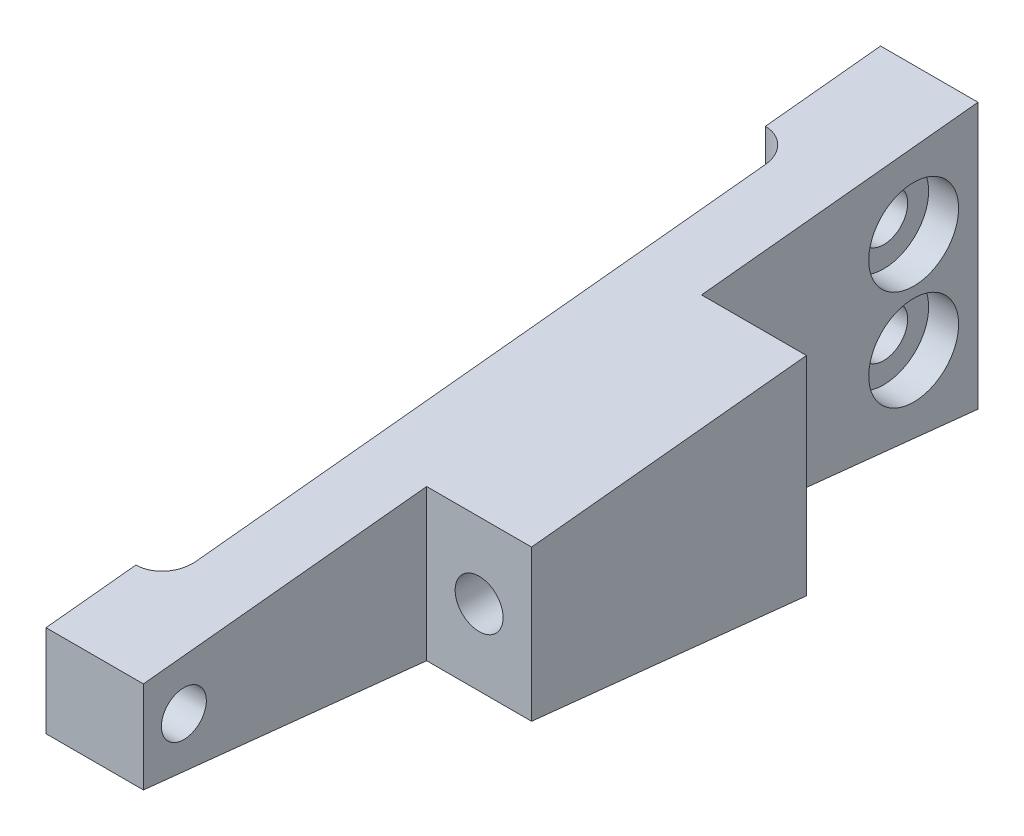
ISO-10303-21;
HEADER;
FILE_DESCRIPTION(('STEP AP214'),'2;1');
FILE_NAME('part.step','',(''),(''),'','','');
FILE_SCHEMA(('AUTOMOTIVE_DESIGN { 1 0 10303 214 1 1 1 1 }'));
ENDSEC;
DATA;
#1=APPLICATION_CONTEXT('core data for automotive mechanical design processes');
#2=APPLICATION_PROTOCOL_DEFINITION('international standard','automotive_design',2000,#1);
#3=PRODUCT_CONTEXT('',#1,'mechanical');
#4=PRODUCT('Part','Part','',(#3));
#5=PRODUCT_RELATED_PRODUCT_CATEGORY('part','',(#4));
#6=PRODUCT_DEFINITION_FORMATION('','',#4);
#7=PRODUCT_DEFINITION_CONTEXT('part definition',#1,'design');
#8=PRODUCT_DEFINITION('design','',#6,#7);
#9=PRODUCT_DEFINITION_SHAPE('','',#8);
#10=(LENGTH_UNIT() NAMED_UNIT(*) SI_UNIT(.MILLI.,.METRE.));
#11=(NAMED_UNIT(*) PLANE_ANGLE_UNIT() SI_UNIT($,.RADIAN.));
#12=(NAMED_UNIT(*) SI_UNIT($,.STERADIAN.) SOLID_ANGLE_UNIT());
#13=UNCERTAINTY_MEASURE_WITH_UNIT(LENGTH_MEASURE(1.E-05),#10,'distance_accuracy_value','');
#14=(GEOMETRIC_REPRESENTATION_CONTEXT(3) GLOBAL_UNCERTAINTY_ASSIGNED_CONTEXT((#13)) GLOBAL_UNIT_ASSIGNED_CONTEXT((#10,
#11,#12)) REPRESENTATION_CONTEXT('',''));
#15=CARTESIAN_POINT('',(0.,0.,0.));
#16=DIRECTION('',(0.,0.,1.));
#17=DIRECTION('',(1.,0.,0.));
#18=AXIS2_PLACEMENT_3D('',#15,#16,#17);
#19=CARTESIAN_POINT('',(-156.520659717532,115.962807964112,228.95028340893));
#20=DIRECTION('',(1.,0.,0.));
#21=DIRECTION('',(0.,-1.,0.));
#22=AXIS2_PLACEMENT_3D('',#19,#20,#21);
#23=PLANE('',#22);
#24=CARTESIAN_POINT('',(-156.520659717532,115.966690244608,229.250284198691));
#25=DIRECTION('',(-1.,0.,0.));
#26=DIRECTION('',(0.,1.,0.));
#27=AXIS2_PLACEMENT_3D('',#24,#25,#26);
#28=CIRCLE('',#27,1.50000002235174);
#29=CARTESIAN_POINT('',(-156.520659717532,114.466690222257,229.250284198691));
#30=VERTEX_POINT('',#29);
#31=EDGE_CURVE('E27',#30,#30,#28,.T.);
#32=ORIENTED_EDGE('',*,*,#31,.F.);
#33=EDGE_LOOP('',(#32));
#34=FACE_BOUND('',#33,.T.);
#35=DIRECTION('',(0.,-0.104293034034684,-0.994546611804515));
#36=VECTOR('',#35,1.);
#37=CARTESIAN_POINT('',(-156.520659717532,112.90155529547,231.95028340893));
#38=LINE('',#37,#36);
#39=CARTESIAN_POINT('',(-156.520659717532,112.90155529547,231.95028340893));
#40=VERTEX_POINT('',#39);
#41=CARTESIAN_POINT('',(-156.520659717532,112.272365877115,225.95028340893));
#42=VERTEX_POINT('',#41);
#43=EDGE_CURVE('E241',#40,#42,#38,.T.);
#44=ORIENTED_EDGE('',*,*,#43,.F.);
#45=DIRECTION('',(0.,1.,0.));
#46=VECTOR('',#45,1.);
#47=CARTESIAN_POINT('',(-156.520659717532,112.90155529547,231.95028340893));
#48=LINE('',#47,#46);
#49=CARTESIAN_POINT('',(-156.520659717532,119.031825193747,231.95028340893));
#50=VERTEX_POINT('',#49);
#51=EDGE_CURVE('E11',#40,#50,#48,.T.);
#52=ORIENTED_EDGE('',*,*,#51,.T.);
#53=DIRECTION('',(0.,-0.103019741551588,0.994679311562598));
#54=VECTOR('',#53,1.);
#55=CARTESIAN_POINT('',(-156.520659717532,124.799997210503,176.257255216579));
#56=LINE('',#55,#54);
#57=CARTESIAN_POINT('',(-156.520659717532,119.65325005111,225.95028340893));
#58=VERTEX_POINT('',#57);
#59=EDGE_CURVE('E297',#58,#50,#56,.T.);
#60=ORIENTED_EDGE('',*,*,#59,.F.);
#61=DIRECTION('',(0.,1.,0.));
#62=VECTOR('',#61,1.);
#63=CARTESIAN_POINT('',(-156.520659717532,112.272365877115,225.95028340893));
#64=LINE('',#63,#62);
#65=EDGE_CURVE('E183',#42,#58,#64,.T.);
#66=ORIENTED_EDGE('',*,*,#65,.F.);
#67=EDGE_LOOP('',(#44,#52,#60,#66));
#68=FACE_BOUND('',#67,.T.);
#69=ADVANCED_FACE('F16',(#34,#68),#23,.F.);
#70=CARTESIAN_POINT('',(-156.520659717532,119.031825193747,231.95028340893));
#71=DIRECTION('',(0.,0.,1.));
#72=DIRECTION('',(0.,-1.,0.));
#73=AXIS2_PLACEMENT_3D('',#70,#71,#72);
#74=PLANE('',#73);
#75=DIRECTION('',(1.,0.,0.));
#76=VECTOR('',#75,1.);
#77=CARTESIAN_POINT('',(-156.520659717532,119.031825193747,231.95028340893));
#78=LINE('',#77,#76);
#79=CARTESIAN_POINT('',(-150.020659717532,119.031825193747,231.95028340893));
#80=VERTEX_POINT('',#79);
#81=EDGE_CURVE('E283',#50,#80,#78,.T.);
#82=ORIENTED_EDGE('',*,*,#81,.F.);
#83=ORIENTED_EDGE('',*,*,#51,.F.);
#84=DIRECTION('',(1.,0.,0.));
#85=VECTOR('',#84,1.);
#86=CARTESIAN_POINT('',(-153.020659717532,112.90155529547,231.95028340893));
#87=LINE('',#86,#85);
#88=CARTESIAN_POINT('',(-150.020659717532,112.90155529547,231.95028340893));
#89=VERTEX_POINT('',#88);
#90=EDGE_CURVE('E239',#40,#89,#87,.T.);
#91=ORIENTED_EDGE('',*,*,#90,.T.);
#92=DIRECTION('',(0.,-1.,0.));
#93=VECTOR('',#92,1.);
#94=CARTESIAN_POINT('',(-150.020659717532,117.481239722751,231.95028340893));
#95=LINE('',#94,#93);
#96=EDGE_CURVE('E259',#80,#89,#95,.T.);
#97=ORIENTED_EDGE('',*,*,#96,.F.);
#98=EDGE_LOOP('',(#82,#83,#91,#97));
#99=FACE_BOUND('',#98,.T.);
#100=ADVANCED_FACE('F412',(#99),#74,.T.);
#101=CARTESIAN_POINT('',(-156.520659717532,115.966690244608,229.250284198691));
#102=DIRECTION('',(1.,0.,0.));
#103=DIRECTION('',(0.,1.,0.));
#104=AXIS2_PLACEMENT_3D('',#101,#102,#103);
#105=CYLINDRICAL_SURFACE('',#104,1.50000002235174);
#106=CARTESIAN_POINT('',(-150.020659717532,115.966690244608,229.250284198691));
#107=DIRECTION('',(-1.,0.,0.));
#108=DIRECTION('',(0.,1.,0.));
#109=AXIS2_PLACEMENT_3D('',#106,#107,#108);
#110=CIRCLE('',#109,1.50000002235174);
#111=CARTESIAN_POINT('',(-150.020659717532,114.466690222257,229.250284198691));
#112=VERTEX_POINT('',#111);
#113=EDGE_CURVE('E301',#112,#112,#110,.T.);
#114=ORIENTED_EDGE('',*,*,#113,.F.);
#115=DIRECTION('',(-1.,0.,0.));
#116=VECTOR('',#115,1.);
#117=CARTESIAN_POINT('',(-156.520659717532,114.466690222257,229.250284198691));
#118=LINE('',#117,#116);
#119=EDGE_CURVE('E275',#112,#30,#118,.T.);
#120=ORIENTED_EDGE('',*,*,#119,.T.);
#121=ORIENTED_EDGE('',*,*,#31,.T.);
#122=ORIENTED_EDGE('',*,*,#119,.F.);
#123=EDGE_LOOP('',(#114,#120,#121,#122));
#124=FACE_BOUND('',#123,.T.);
#125=ADVANCED_FACE('F454',(#124),#105,.F.);
#126=CARTESIAN_POINT('',(-156.520659717532,115.930654251756,180.102366744316));
#127=DIRECTION('',(1.,0.,0.));
#128=DIRECTION('',(0.,0.,-1.));
#129=AXIS2_PLACEMENT_3D('',#126,#127,#128);
#130=PLANE('',#129);
#131=CARTESIAN_POINT('',(-156.520659717532,119.316690244608,180.550283500966));
#132=DIRECTION('',(1.,0.,0.));
#133=DIRECTION('',(0.,1.,0.));
#134=AXIS2_PLACEMENT_3D('',#131,#132,#133);
#135=CIRCLE('',#134,1.6);
#136=CARTESIAN_POINT('',(-156.520659717532,117.716690244608,180.550283500966));
#137=VERTEX_POINT('',#136);
#138=EDGE_CURVE('E148',#137,#137,#135,.T.);
#139=ORIENTED_EDGE('',*,*,#138,.T.);
#140=EDGE_LOOP('',(#139));
#141=FACE_BOUND('',#140,.T.);
#142=CARTESIAN_POINT('',(-156.520659717532,112.616690244608,180.550283500966));
#143=DIRECTION('',(1.,0.,0.));
#144=DIRECTION('',(0.,1.,0.));
#145=AXIS2_PLACEMENT_3D('',#142,#143,#144);
#146=CIRCLE('',#145,1.6);
#147=CARTESIAN_POINT('',(-156.520659717532,111.016690244608,180.550283500966));
#148=VERTEX_POINT('',#147);
#149=EDGE_CURVE('E139',#148,#148,#146,.T.);
#150=ORIENTED_EDGE('',*,*,#149,.T.);
#151=EDGE_LOOP('',(#150));
#152=FACE_BOUND('',#151,.T.);
#153=DIRECTION('',(0.,1.,0.));
#154=VECTOR('',#153,1.);
#155=CARTESIAN_POINT('',(-156.520659717532,107.061311293008,176.257255216579));
#156=LINE('',#155,#154);
#157=CARTESIAN_POINT('',(-156.520659717532,107.061311293008,176.257255216579));
#158=VERTEX_POINT('',#157);
#159=CARTESIAN_POINT('',(-156.520659717532,124.799997210503,176.257255216579));
#160=VERTEX_POINT('',#159);
#161=EDGE_CURVE('E202',#158,#160,#156,.T.);
#162=ORIENTED_EDGE('',*,*,#161,.F.);
#163=DIRECTION('',(0.,-0.104293034034684,-0.994546611804515));
#164=VECTOR('',#163,1.);
#165=CARTESIAN_POINT('',(-156.520659717532,112.90155529547,231.95028340893));
#166=LINE('',#165,#164);
#167=CARTESIAN_POINT('',(-156.520659717532,107.867745788224,183.947478272054));
#168=VERTEX_POINT('',#167);
#169=EDGE_CURVE('E198',#168,#158,#166,.T.);
#170=ORIENTED_EDGE('',*,*,#169,.F.);
#171=DIRECTION('',(0.,1.,0.));
#172=VECTOR('',#171,1.);
#173=CARTESIAN_POINT('',(-156.520659717532,107.867745788224,183.947478272054));
#174=LINE('',#173,#172);
#175=CARTESIAN_POINT('',(-156.520659717532,124.003514582947,183.947478272054));
#176=VERTEX_POINT('',#175);
#177=EDGE_CURVE('E191',#168,#176,#174,.T.);
#178=ORIENTED_EDGE('',*,*,#177,.T.);
#179=DIRECTION('',(0.,-0.103019741551588,0.994679311562598));
#180=VECTOR('',#179,1.);
#181=CARTESIAN_POINT('',(-156.520659717532,124.799997210503,176.257255216579));
#182=LINE('',#181,#180);
#183=EDGE_CURVE('E195',#160,#176,#182,.T.);
#184=ORIENTED_EDGE('',*,*,#183,.F.);
#185=EDGE_LOOP('',(#162,#170,#178,#184));
#186=FACE_BOUND('',#185,.T.);
#187=ADVANCED_FACE('F193',(#141,#152,#186),#130,.F.);
#188=CARTESIAN_POINT('',(-156.520659717532,114.10399803135,223.95028340893));
#189=DIRECTION('',(0.,-1.,0.));
#190=DIRECTION('',(0.707106781186554,0.,0.707106781186541));
#191=AXIS2_PLACEMENT_3D('',#188,#189,#190);
#192=CYLINDRICAL_SURFACE('',#191,2.);
#193=CARTESIAN_POINT('',(-156.520659717532,119.860391670231,223.95028340893));
#194=DIRECTION('',(0.,0.994679311562598,0.103019741551588));
#195=DIRECTION('',(0.,-0.103019741551588,0.994679311562598));
#196=AXIS2_PLACEMENT_3D('',#193,#194,#195);
#197=ELLIPSE('',#196,2.01069829919161,2.);
#198=CARTESIAN_POINT('',(-154.520659717532,119.860391670231,223.95028340893));
#199=VERTEX_POINT('',#198);
#200=EDGE_CURVE('E212',#58,#199,#197,.T.);
#201=ORIENTED_EDGE('',*,*,#200,.T.);
#202=DIRECTION('',(0.,-1.,0.));
#203=VECTOR('',#202,1.);
#204=CARTESIAN_POINT('',(-154.520659717532,114.10399803135,223.95028340893));
#205=LINE('',#204,#203);
#206=CARTESIAN_POINT('',(-154.520659717532,112.062636070996,223.95028340893));
#207=VERTEX_POINT('',#206);
#208=EDGE_CURVE('E227',#199,#207,#205,.T.);
#209=ORIENTED_EDGE('',*,*,#208,.T.);
#210=CARTESIAN_POINT('',(-156.520659717532,112.062636070996,223.95028340893));
#211=DIRECTION('',(0.,-0.994546611804515,0.104293034034684));
#212=DIRECTION('',(0.,0.104293034034684,0.994546611804515));
#213=AXIS2_PLACEMENT_3D('',#210,#211,#212);
#214=ELLIPSE('',#213,2.01096658141661,2.);
#215=EDGE_CURVE('E223',#207,#42,#214,.T.);
#216=ORIENTED_EDGE('',*,*,#215,.T.);
#217=ORIENTED_EDGE('',*,*,#65,.T.);
#218=EDGE_LOOP('',(#201,#209,#216,#217));
#219=FACE_BOUND('',#218,.T.);
#220=ADVANCED_FACE('F404',(#219),#192,.F.);
#221=CARTESIAN_POINT('',(-156.520659717532,119.969572384266,185.947478272054));
#222=DIRECTION('',(0.,1.,0.));
#223=DIRECTION('',(0.707106781186554,0.,-0.707106781186541));
#224=AXIS2_PLACEMENT_3D('',#221,#222,#223);
#225=CYLINDRICAL_SURFACE('',#224,2.);
#226=CARTESIAN_POINT('',(-156.520659717532,108.077475594342,185.947478272054));
#227=DIRECTION('',(0.,-0.994546611804515,0.104293034034684));
#228=DIRECTION('',(0.,-0.104293034034684,-0.994546611804515));
#229=AXIS2_PLACEMENT_3D('',#226,#227,#228);
#230=ELLIPSE('',#229,2.01096658141661,2.);
#231=CARTESIAN_POINT('',(-154.520659717532,108.077475594342,185.947478272054));
#232=VERTEX_POINT('',#231);
#233=EDGE_CURVE('E309',#168,#232,#230,.T.);
#234=ORIENTED_EDGE('',*,*,#233,.T.);
#235=DIRECTION('',(0.,1.,0.));
#236=VECTOR('',#235,1.);
#237=CARTESIAN_POINT('',(-154.520659717532,119.969572384266,185.947478272054));
#238=LINE('',#237,#236);
#239=CARTESIAN_POINT('',(-154.520659717532,123.796372963826,185.947478272054));
#240=VERTEX_POINT('',#239);
#241=EDGE_CURVE('E207',#232,#240,#238,.T.);
#242=ORIENTED_EDGE('',*,*,#241,.T.);
#243=CARTESIAN_POINT('',(-156.520659717532,123.796372963826,185.947478272054));
#244=DIRECTION('',(0.,0.994679311562598,0.103019741551588));
#245=DIRECTION('',(0.,0.103019741551588,-0.994679311562598));
#246=AXIS2_PLACEMENT_3D('',#243,#244,#245);
#247=ELLIPSE('',#246,2.01069829919161,2.);
#248=EDGE_CURVE('E205',#240,#176,#247,.T.);
#249=ORIENTED_EDGE('',*,*,#248,.T.);
#250=ORIENTED_EDGE('',*,*,#177,.F.);
#251=EDGE_LOOP('',(#234,#242,#249,#250));
#252=FACE_BOUND('',#251,.T.);
#253=ADVANCED_FACE('F18',(#252),#225,.F.);
#254=CARTESIAN_POINT('',(-156.520659717532,107.061311293008,176.257255216579));
#255=DIRECTION('',(0.,0.,-1.));
#256=DIRECTION('',(-1.,0.,0.));
#257=AXIS2_PLACEMENT_3D('',#254,#255,#256);
#258=PLANE('',#257);
#259=DIRECTION('',(1.,0.,0.));
#260=VECTOR('',#259,1.);
#261=CARTESIAN_POINT('',(-153.020659717532,107.061311293008,176.257255216579));
#262=LINE('',#261,#260);
#263=CARTESIAN_POINT('',(-150.020659717532,107.061311293008,176.257255216579));
#264=VERTEX_POINT('',#263);
#265=EDGE_CURVE('E242',#158,#264,#262,.T.);
#266=ORIENTED_EDGE('',*,*,#265,.F.);
#267=ORIENTED_EDGE('',*,*,#161,.T.);
#268=DIRECTION('',(1.,0.,0.));
#269=VECTOR('',#268,1.);
#270=CARTESIAN_POINT('',(-156.520659717532,124.799997210503,176.257255216579));
#271=LINE('',#270,#269);
#272=CARTESIAN_POINT('',(-150.020659717532,124.799997210503,176.257255216579));
#273=VERTEX_POINT('',#272);
#274=EDGE_CURVE('E216',#160,#273,#271,.T.);
#275=ORIENTED_EDGE('',*,*,#274,.T.);
#276=DIRECTION('',(0.,1.,0.));
#277=VECTOR('',#276,1.);
#278=CARTESIAN_POINT('',(-150.020659717532,111.495982772382,176.257255216579));
#279=LINE('',#278,#277);
#280=EDGE_CURVE('E291',#264,#273,#279,.T.);
#281=ORIENTED_EDGE('',*,*,#280,.F.);
#282=EDGE_LOOP('',(#266,#267,#275,#281));
#283=FACE_BOUND('',#282,.T.);
#284=ADVANCED_FACE('F433',(#283),#258,.T.);
#285=CARTESIAN_POINT('',(-156.520659717532,119.65325005111,225.95028340893));
#286=DIRECTION('',(0.,0.994679311562598,0.103019741551588));
#287=DIRECTION('',(1.,0.,0.));
#288=AXIS2_PLACEMENT_3D('',#285,#286,#287);
#289=PLANE('',#288);
#290=DIRECTION('',(0.,-0.103019741551578,0.994679311562599));
#291=VECTOR('',#290,1.);
#292=CARTESIAN_POINT('',(-143.020659717532,124.799997210503,176.257255216579));
#293=LINE('',#292,#291);
#294=CARTESIAN_POINT('',(-143.020659717532,122.889402857295,194.704483362388));
#295=VERTEX_POINT('',#294);
#296=CARTESIAN_POINT('',(-143.020659717532,120.989503839075,213.048445587677));
#297=VERTEX_POINT('',#296);
#298=EDGE_CURVE('E250',#295,#297,#293,.T.);
#299=ORIENTED_EDGE('',*,*,#298,.F.);
#300=DIRECTION('',(1.,0.,0.));
#301=VECTOR('',#300,1.);
#302=CARTESIAN_POINT('',(-150.020659717532,122.889402857295,194.704483362388));
#303=LINE('',#302,#301);
#304=CARTESIAN_POINT('',(-150.020659717532,122.889402857295,194.704483362388));
#305=VERTEX_POINT('',#304);
#306=EDGE_CURVE('E276',#305,#295,#303,.T.);
#307=ORIENTED_EDGE('',*,*,#306,.F.);
#308=DIRECTION('',(0.,-0.103019741551588,0.994679311562598));
#309=VECTOR('',#308,1.);
#310=CARTESIAN_POINT('',(-150.020659717532,121.982550788624,203.46034877002));
#311=LINE('',#310,#309);
#312=EDGE_CURVE('E295',#273,#305,#311,.T.);
#313=ORIENTED_EDGE('',*,*,#312,.F.);
#314=ORIENTED_EDGE('',*,*,#274,.F.);
#315=ORIENTED_EDGE('',*,*,#183,.T.);
#316=ORIENTED_EDGE('',*,*,#248,.F.);
#317=DIRECTION('',(0.,-0.103019741551588,0.994679311562598));
#318=VECTOR('',#317,1.);
#319=CARTESIAN_POINT('',(-154.520659717532,122.884678362955,194.75009944244));
#320=LINE('',#319,#318);
#321=EDGE_CURVE('E231',#240,#199,#320,.T.);
#322=ORIENTED_EDGE('',*,*,#321,.T.);
#323=ORIENTED_EDGE('',*,*,#200,.F.);
#324=ORIENTED_EDGE('',*,*,#59,.T.);
#325=ORIENTED_EDGE('',*,*,#81,.T.);
#326=DIRECTION('',(0.,-0.103019741551588,0.994679311562598));
#327=VECTOR('',#326,1.);
#328=CARTESIAN_POINT('',(-150.020659717532,121.982550788624,203.46034877002));
#329=LINE('',#328,#327);
#330=CARTESIAN_POINT('',(-150.020659717532,120.989503839075,213.048445587677));
#331=VERTEX_POINT('',#330);
#332=EDGE_CURVE('E255',#331,#80,#329,.T.);
#333=ORIENTED_EDGE('',*,*,#332,.F.);
#334=DIRECTION('',(1.,0.,0.));
#335=VECTOR('',#334,1.);
#336=CARTESIAN_POINT('',(-153.270659717532,120.989503839075,213.048445587677));
#337=LINE('',#336,#335);
#338=EDGE_CURVE('E267',#331,#297,#337,.T.);
#339=ORIENTED_EDGE('',*,*,#338,.T.);
#340=EDGE_LOOP('',(#299,#307,#313,#314,#315,#316,#322,#323,#324,#325,#333,#339));
#341=FACE_BOUND('',#340,.T.);
#342=ADVANCED_FACE('F214',(#341),#289,.T.);
#343=CARTESIAN_POINT('',(-156.520659717532,112.90155529547,231.95028340893));
#344=DIRECTION('',(0.,-0.994546611804515,0.104293034034684));
#345=DIRECTION('',(-1.,0.,0.));
#346=AXIS2_PLACEMENT_3D('',#343,#344,#345);
#347=PLANE('',#346);
#348=DIRECTION('',(0.,-0.104293034034684,-0.994546611804515));
#349=VECTOR('',#348,1.);
#350=CARTESIAN_POINT('',(-154.520659717532,111.203110889371,215.75378337364));
#351=LINE('',#350,#349);
#352=EDGE_CURVE('E232',#207,#232,#351,.T.);
#353=ORIENTED_EDGE('',*,*,#352,.T.);
#354=ORIENTED_EDGE('',*,*,#233,.F.);
#355=ORIENTED_EDGE('',*,*,#169,.T.);
#356=ORIENTED_EDGE('',*,*,#265,.T.);
#357=DIRECTION('',(0.,-0.104293034034684,-0.994546611804515));
#358=VECTOR('',#357,1.);
#359=CARTESIAN_POINT('',(-150.020659717532,110.229085099127,206.465396488895));
#360=LINE('',#359,#358);
#361=CARTESIAN_POINT('',(-150.020659717532,108.995778084229,194.704483362388));
#362=VERTEX_POINT('',#361);
#363=EDGE_CURVE('E296',#362,#264,#360,.T.);
#364=ORIENTED_EDGE('',*,*,#363,.F.);
#365=DIRECTION('',(1.,0.,0.));
#366=VECTOR('',#365,1.);
#367=CARTESIAN_POINT('',(-150.020659717532,108.995778084229,194.704483362388));
#368=LINE('',#367,#366);
#369=CARTESIAN_POINT('',(-143.020659717532,108.995778084229,194.704483362388));
#370=VERTEX_POINT('',#369);
#371=EDGE_CURVE('E251',#362,#370,#368,.T.);
#372=ORIENTED_EDGE('',*,*,#371,.T.);
#373=DIRECTION('',(0.,-0.104293034034673,-0.994546611804516));
#374=VECTOR('',#373,1.);
#375=CARTESIAN_POINT('',(-143.020659717532,112.90155529547,231.95028340893));
#376=LINE('',#375,#374);
#377=CARTESIAN_POINT('',(-143.020659717532,110.919415904704,213.048445587677));
#378=VERTEX_POINT('',#377);
#379=EDGE_CURVE('E247',#378,#370,#376,.T.);
#380=ORIENTED_EDGE('',*,*,#379,.F.);
#381=DIRECTION('',(1.,0.,0.));
#382=VECTOR('',#381,1.);
#383=CARTESIAN_POINT('',(-153.270659717532,110.919415904704,213.048445587677));
#384=LINE('',#383,#382);
#385=CARTESIAN_POINT('',(-150.020659717532,110.919415904704,213.048445587677));
#386=VERTEX_POINT('',#385);
#387=EDGE_CURVE('E268',#386,#378,#384,.T.);
#388=ORIENTED_EDGE('',*,*,#387,.F.);
#389=DIRECTION('',(0.,-0.104293034034684,-0.994546611804515));
#390=VECTOR('',#389,1.);
#391=CARTESIAN_POINT('',(-150.020659717532,110.229085099127,206.465396488895));
#392=LINE('',#391,#390);
#393=EDGE_CURVE('E272',#89,#386,#392,.T.);
#394=ORIENTED_EDGE('',*,*,#393,.F.);
#395=ORIENTED_EDGE('',*,*,#90,.F.);
#396=ORIENTED_EDGE('',*,*,#43,.T.);
#397=ORIENTED_EDGE('',*,*,#215,.F.);
#398=EDGE_LOOP('',(#353,#354,#355,#356,#364,#372,#380,#388,#394,#395,#396,#397));
#399=FACE_BOUND('',#398,.T.);
#400=ADVANCED_FACE('F396',(#399),#347,.T.);
#401=CARTESIAN_POINT('',(-150.020659717532,115.930654251756,180.102366744316));
#402=DIRECTION('',(1.,0.,0.));
#403=DIRECTION('',(0.,0.,-1.));
#404=AXIS2_PLACEMENT_3D('',#401,#402,#403);
#405=PLANE('',#404);
#406=CARTESIAN_POINT('',(-150.020659717532,119.316690244608,180.550283500966));
#407=DIRECTION('',(-1.,0.,0.));
#408=DIRECTION('',(0.,1.,0.));
#409=AXIS2_PLACEMENT_3D('',#406,#407,#408);
#410=CIRCLE('',#409,3.);
#411=CARTESIAN_POINT('',(-150.020659717532,116.316690244608,180.550283500966));
#412=VERTEX_POINT('',#411);
#413=EDGE_CURVE('E314',#412,#412,#410,.T.);
#414=ORIENTED_EDGE('',*,*,#413,.T.);
#415=EDGE_LOOP('',(#414));
#416=FACE_BOUND('',#415,.T.);
#417=CARTESIAN_POINT('',(-150.020659717532,112.616690244608,180.550283500966));
#418=DIRECTION('',(-1.,0.,0.));
#419=DIRECTION('',(0.,1.,0.));
#420=AXIS2_PLACEMENT_3D('',#417,#418,#419);
#421=CIRCLE('',#420,3.);
#422=CARTESIAN_POINT('',(-150.020659717532,109.616690244608,180.550283500966));
#423=VERTEX_POINT('',#422);
#424=EDGE_CURVE('E238',#423,#423,#421,.T.);
#425=ORIENTED_EDGE('',*,*,#424,.T.);
#426=EDGE_LOOP('',(#425));
#427=FACE_BOUND('',#426,.T.);
#428=DIRECTION('',(0.,-1.,0.));
#429=VECTOR('',#428,1.);
#430=CARTESIAN_POINT('',(-150.020659717532,112.463216167992,194.704483362388));
#431=LINE('',#430,#429);
#432=EDGE_CURVE('E280',#305,#362,#431,.T.);
#433=ORIENTED_EDGE('',*,*,#432,.T.);
#434=ORIENTED_EDGE('',*,*,#363,.T.);
#435=ORIENTED_EDGE('',*,*,#280,.T.);
#436=ORIENTED_EDGE('',*,*,#312,.T.);
#437=EDGE_LOOP('',(#433,#434,#435,#436));
#438=FACE_BOUND('',#437,.T.);
#439=ADVANCED_FACE('F431',(#416,#427,#438),#405,.T.);
#440=CARTESIAN_POINT('',(-150.020659717532,115.930654251756,180.102366744316));
#441=DIRECTION('',(1.,0.,0.));
#442=DIRECTION('',(0.,0.,-1.));
#443=AXIS2_PLACEMENT_3D('',#440,#441,#442);
#444=PLANE('',#443);
#445=ORIENTED_EDGE('',*,*,#113,.T.);
#446=EDGE_LOOP('',(#445));
#447=FACE_BOUND('',#446,.T.);
#448=DIRECTION('',(0.,1.,0.));
#449=VECTOR('',#448,1.);
#450=CARTESIAN_POINT('',(-150.020659717532,118.356508235855,213.048445587677));
#451=LINE('',#450,#449);
#452=EDGE_CURVE('E286',#386,#331,#451,.T.);
#453=ORIENTED_EDGE('',*,*,#452,.T.);
#454=ORIENTED_EDGE('',*,*,#332,.T.);
#455=ORIENTED_EDGE('',*,*,#96,.T.);
#456=ORIENTED_EDGE('',*,*,#393,.T.);
#457=EDGE_LOOP('',(#453,#454,#455,#456));
#458=FACE_BOUND('',#457,.T.);
#459=ADVANCED_FACE('F419',(#447,#458),#444,.T.);
#460=CARTESIAN_POINT('',(-143.020659717532,115.966690244609,204.876464475032));
#461=DIRECTION('',(1.,0.,0.));
#462=DIRECTION('',(0.,0.,-1.));
#463=AXIS2_PLACEMENT_3D('',#460,#461,#462);
#464=PLANE('',#463);
#465=ORIENTED_EDGE('',*,*,#379,.T.);
#466=DIRECTION('',(0.,1.,0.));
#467=VECTOR('',#466,1.);
#468=CARTESIAN_POINT('',(-143.020659717532,108.995778084229,194.704483362388));
#469=LINE('',#468,#467);
#470=EDGE_CURVE('E20',#370,#295,#469,.T.);
#471=ORIENTED_EDGE('',*,*,#470,.T.);
#472=ORIENTED_EDGE('',*,*,#298,.T.);
#473=DIRECTION('',(0.,-1.,0.));
#474=VECTOR('',#473,1.);
#475=CARTESIAN_POINT('',(-143.020659717532,118.374526232282,213.048445587677));
#476=LINE('',#475,#474);
#477=EDGE_CURVE('E263',#297,#378,#476,.T.);
#478=ORIENTED_EDGE('',*,*,#477,.T.);
#479=EDGE_LOOP('',(#465,#471,#472,#478));
#480=FACE_BOUND('',#479,.T.);
#481=ADVANCED_FACE('F425',(#480),#464,.T.);
#482=CARTESIAN_POINT('',(-150.020659717532,108.995778084229,194.704483362388));
#483=DIRECTION('',(0.,0.,-1.));
#484=DIRECTION('',(0.,-1.,0.));
#485=AXIS2_PLACEMENT_3D('',#482,#483,#484);
#486=PLANE('',#485);
#487=CARTESIAN_POINT('',(-146.520659717532,115.955753965388,194.704483362388));
#488=DIRECTION('',(0.,0.,1.));
#489=DIRECTION('',(-1.,0.,0.));
#490=AXIS2_PLACEMENT_3D('',#487,#488,#489);
#491=CIRCLE('',#490,1.6);
#492=CARTESIAN_POINT('',(-144.920659717532,115.955753965388,194.704483362388));
#493=VERTEX_POINT('',#492);
#494=EDGE_CURVE('E287',#493,#493,#491,.T.);
#495=ORIENTED_EDGE('',*,*,#494,.T.);
#496=EDGE_LOOP('',(#495));
#497=FACE_BOUND('',#496,.T.);
#498=ORIENTED_EDGE('',*,*,#432,.F.);
#499=ORIENTED_EDGE('',*,*,#306,.T.);
#500=ORIENTED_EDGE('',*,*,#470,.F.);
#501=ORIENTED_EDGE('',*,*,#371,.F.);
#502=EDGE_LOOP('',(#498,#499,#500,#501));
#503=FACE_BOUND('',#502,.T.);
#504=ADVANCED_FACE('F429',(#497,#503),#486,.T.);
#505=CARTESIAN_POINT('',(-146.520659717532,115.955753965388,215.048445587677));
#506=DIRECTION('',(0.,0.,-1.));
#507=DIRECTION('',(-1.,0.,0.));
#508=AXIS2_PLACEMENT_3D('',#505,#506,#507);
#509=CYLINDRICAL_SURFACE('',#508,1.6);
#510=CARTESIAN_POINT('',(-146.520659717532,115.955753965388,213.048445587677));
#511=DIRECTION('',(0.,0.,1.));
#512=DIRECTION('',(-1.,0.,0.));
#513=AXIS2_PLACEMENT_3D('',#510,#511,#512);
#514=CIRCLE('',#513,1.6);
#515=CARTESIAN_POINT('',(-144.920659717532,115.955753965388,213.048445587677));
#516=VERTEX_POINT('',#515);
#517=EDGE_CURVE('E329',#516,#516,#514,.T.);
#518=ORIENTED_EDGE('',*,*,#517,.T.);
#519=DIRECTION('',(0.,0.,-1.));
#520=VECTOR('',#519,1.);
#521=CARTESIAN_POINT('',(-144.920659717532,115.955753965388,215.048445587677));
#522=LINE('',#521,#520);
#523=EDGE_CURVE('E290',#516,#493,#522,.T.);
#524=ORIENTED_EDGE('',*,*,#523,.T.);
#525=ORIENTED_EDGE('',*,*,#494,.F.);
#526=ORIENTED_EDGE('',*,*,#523,.F.);
#527=EDGE_LOOP('',(#518,#524,#525,#526));
#528=FACE_BOUND('',#527,.T.);
#529=ADVANCED_FACE('F484',(#528),#509,.F.);
#530=CARTESIAN_POINT('',(-146.520659717532,115.955753965388,213.048445587677));
#531=DIRECTION('',(0.,0.,1.));
#532=DIRECTION('',(1.,0.,0.));
#533=AXIS2_PLACEMENT_3D('',#530,#531,#532);
#534=PLANE('',#533);
#535=ORIENTED_EDGE('',*,*,#517,.F.);
#536=EDGE_LOOP('',(#535));
#537=FACE_BOUND('',#536,.T.);
#538=ORIENTED_EDGE('',*,*,#452,.F.);
#539=ORIENTED_EDGE('',*,*,#387,.T.);
#540=ORIENTED_EDGE('',*,*,#477,.F.);
#541=ORIENTED_EDGE('',*,*,#338,.F.);
#542=EDGE_LOOP('',(#538,#539,#540,#541));
#543=FACE_BOUND('',#542,.T.);
#544=ADVANCED_FACE('F418',(#537,#543),#534,.T.);
#545=CARTESIAN_POINT('',(-154.520659717532,115.935630185585,204.948880840492));
#546=DIRECTION('',(1.,0.,0.));
#547=DIRECTION('',(0.,1.,0.));
#548=AXIS2_PLACEMENT_3D('',#545,#546,#547);
#549=PLANE('',#548);
#550=ORIENTED_EDGE('',*,*,#352,.F.);
#551=ORIENTED_EDGE('',*,*,#208,.F.);
#552=ORIENTED_EDGE('',*,*,#321,.F.);
#553=ORIENTED_EDGE('',*,*,#241,.F.);
#554=EDGE_LOOP('',(#550,#551,#552,#553));
#555=FACE_BOUND('',#554,.T.);
#556=ADVANCED_FACE('F401',(#555),#549,.F.);
#557=CARTESIAN_POINT('',(-150.020659717532,119.316690244608,180.550283500966));
#558=DIRECTION('',(-1.,0.,0.));
#559=DIRECTION('',(0.,1.,0.));
#560=AXIS2_PLACEMENT_3D('',#557,#558,#559);
#561=CYLINDRICAL_SURFACE('',#560,1.6);
#562=CARTESIAN_POINT('',(-152.020659717532,119.316690244608,180.550283500966));
#563=DIRECTION('',(1.,0.,0.));
#564=DIRECTION('',(0.,1.,0.));
#565=AXIS2_PLACEMENT_3D('',#562,#563,#564);
#566=CIRCLE('',#565,1.6);
#567=CARTESIAN_POINT('',(-152.020659717532,117.716690244608,180.550283500966));
#568=VERTEX_POINT('',#567);
#569=EDGE_CURVE('E347',#568,#568,#566,.T.);
#570=ORIENTED_EDGE('',*,*,#569,.T.);
#571=DIRECTION('',(-1.,0.,0.));
#572=VECTOR('',#571,1.);
#573=CARTESIAN_POINT('',(-150.020659717532,117.716690244608,180.550283500966));
#574=LINE('',#573,#572);
#575=EDGE_CURVE('E254',#568,#137,#574,.T.);
#576=ORIENTED_EDGE('',*,*,#575,.T.);
#577=ORIENTED_EDGE('',*,*,#138,.F.);
#578=ORIENTED_EDGE('',*,*,#575,.F.);
#579=EDGE_LOOP('',(#570,#576,#577,#578));
#580=FACE_BOUND('',#579,.T.);
#581=ADVANCED_FACE('F472',(#580),#561,.F.);
#582=CARTESIAN_POINT('',(-150.020659717532,112.616690244608,180.550283500966));
#583=DIRECTION('',(-1.,0.,0.));
#584=DIRECTION('',(0.,1.,0.));
#585=AXIS2_PLACEMENT_3D('',#582,#583,#584);
#586=CYLINDRICAL_SURFACE('',#585,1.6);
#587=CARTESIAN_POINT('',(-152.020659717532,112.616690244608,180.550283500966));
#588=DIRECTION('',(1.,0.,0.));
#589=DIRECTION('',(0.,1.,0.));
#590=AXIS2_PLACEMENT_3D('',#587,#588,#589);
#591=CIRCLE('',#590,1.6);
#592=CARTESIAN_POINT('',(-152.020659717532,111.016690244608,180.550283500966));
#593=VERTEX_POINT('',#592);
#594=EDGE_CURVE('E310',#593,#593,#591,.T.);
#595=ORIENTED_EDGE('',*,*,#594,.T.);
#596=DIRECTION('',(-1.,0.,0.));
#597=VECTOR('',#596,1.);
#598=CARTESIAN_POINT('',(-150.020659717532,111.016690244608,180.550283500966));
#599=LINE('',#598,#597);
#600=EDGE_CURVE('E322',#593,#148,#599,.T.);
#601=ORIENTED_EDGE('',*,*,#600,.T.);
#602=ORIENTED_EDGE('',*,*,#149,.F.);
#603=ORIENTED_EDGE('',*,*,#600,.F.);
#604=EDGE_LOOP('',(#595,#601,#602,#603));
#605=FACE_BOUND('',#604,.T.);
#606=ADVANCED_FACE('F468',(#605),#586,.F.);
#607=CARTESIAN_POINT('',(-152.020659717532,119.316690244608,180.550283500966));
#608=DIRECTION('',(1.,0.,0.));
#609=DIRECTION('',(0.,0.,-1.));
#610=AXIS2_PLACEMENT_3D('',#607,#608,#609);
#611=PLANE('',#610);
#612=ORIENTED_EDGE('',*,*,#569,.F.);
#613=EDGE_LOOP('',(#612));
#614=FACE_BOUND('',#613,.T.);
#615=CARTESIAN_POINT('',(-152.020659717532,119.316690244608,180.550283500966));
#616=DIRECTION('',(-1.,0.,0.));
#617=DIRECTION('',(0.,1.,0.));
#618=AXIS2_PLACEMENT_3D('',#615,#616,#617);
#619=CIRCLE('',#618,3.);
#620=CARTESIAN_POINT('',(-152.020659717532,116.316690244608,180.550283500966));
#621=VERTEX_POINT('',#620);
#622=EDGE_CURVE('E377',#621,#621,#619,.T.);
#623=ORIENTED_EDGE('',*,*,#622,.F.);
#624=EDGE_LOOP('',(#623));
#625=FACE_BOUND('',#624,.T.);
#626=ADVANCED_FACE('F471',(#614,#625),#611,.T.);
#627=CARTESIAN_POINT('',(-150.020659717532,119.316690244608,180.550283500966));
#628=DIRECTION('',(-1.,0.,0.));
#629=DIRECTION('',(0.,1.,0.));
#630=AXIS2_PLACEMENT_3D('',#627,#628,#629);
#631=CYLINDRICAL_SURFACE('',#630,3.);
#632=ORIENTED_EDGE('',*,*,#413,.F.);
#633=DIRECTION('',(-1.,0.,0.));
#634=VECTOR('',#633,1.);
#635=CARTESIAN_POINT('',(-150.020659717532,116.316690244608,180.550283500966));
#636=LINE('',#635,#634);
#637=EDGE_CURVE('E335',#412,#621,#636,.T.);
#638=ORIENTED_EDGE('',*,*,#637,.T.);
#639=ORIENTED_EDGE('',*,*,#622,.T.);
#640=ORIENTED_EDGE('',*,*,#637,.F.);
#641=EDGE_LOOP('',(#632,#638,#639,#640));
#642=FACE_BOUND('',#641,.T.);
#643=ADVANCED_FACE('F461',(#642),#631,.F.);
#644=CARTESIAN_POINT('',(-152.020659717532,112.616690244608,180.550283500966));
#645=DIRECTION('',(1.,0.,0.));
#646=DIRECTION('',(0.,0.,-1.));
#647=AXIS2_PLACEMENT_3D('',#644,#645,#646);
#648=PLANE('',#647);
#649=ORIENTED_EDGE('',*,*,#594,.F.);
#650=EDGE_LOOP('',(#649));
#651=FACE_BOUND('',#650,.T.);
#652=CARTESIAN_POINT('',(-152.020659717532,112.616690244608,180.550283500966));
#653=DIRECTION('',(-1.,0.,0.));
#654=DIRECTION('',(0.,1.,0.));
#655=AXIS2_PLACEMENT_3D('',#652,#653,#654);
#656=CIRCLE('',#655,3.);
#657=CARTESIAN_POINT('',(-152.020659717532,109.616690244608,180.550283500966));
#658=VERTEX_POINT('',#657);
#659=EDGE_CURVE('E237',#658,#658,#656,.T.);
#660=ORIENTED_EDGE('',*,*,#659,.F.);
#661=EDGE_LOOP('',(#660));
#662=FACE_BOUND('',#661,.T.);
#663=ADVANCED_FACE('F457',(#651,#662),#648,.T.);
#664=CARTESIAN_POINT('',(-150.020659717532,112.616690244608,180.550283500966));
#665=DIRECTION('',(-1.,0.,0.));
#666=DIRECTION('',(0.,1.,0.));
#667=AXIS2_PLACEMENT_3D('',#664,#665,#666);
#668=CYLINDRICAL_SURFACE('',#667,3.);
#669=ORIENTED_EDGE('',*,*,#424,.F.);
#670=DIRECTION('',(-1.,0.,0.));
#671=VECTOR('',#670,1.);
#672=CARTESIAN_POINT('',(-150.020659717532,109.616690244608,180.550283500966));
#673=LINE('',#672,#671);
#674=EDGE_CURVE('E233',#423,#658,#673,.T.);
#675=ORIENTED_EDGE('',*,*,#674,.T.);
#676=ORIENTED_EDGE('',*,*,#659,.T.);
#677=ORIENTED_EDGE('',*,*,#674,.F.);
#678=EDGE_LOOP('',(#669,#675,#676,#677));
#679=FACE_BOUND('',#678,.T.);
#680=ADVANCED_FACE('F460',(#679),#668,.F.);
#681=CLOSED_SHELL('',(#69,#100,#125,#187,#220,#253,#284,#342,#400,#439,#459,#481,#504,#529,#544,
#556,#581,#606,#626,#643,#663,#680));
#682=MANIFOLD_SOLID_BREP('B1',#681);
#683=ADVANCED_BREP_SHAPE_REPRESENTATION('',(#18,#682),#14);
#684=SHAPE_DEFINITION_REPRESENTATION(#9,#683);
ENDSEC;
END-ISO-10303-21;
